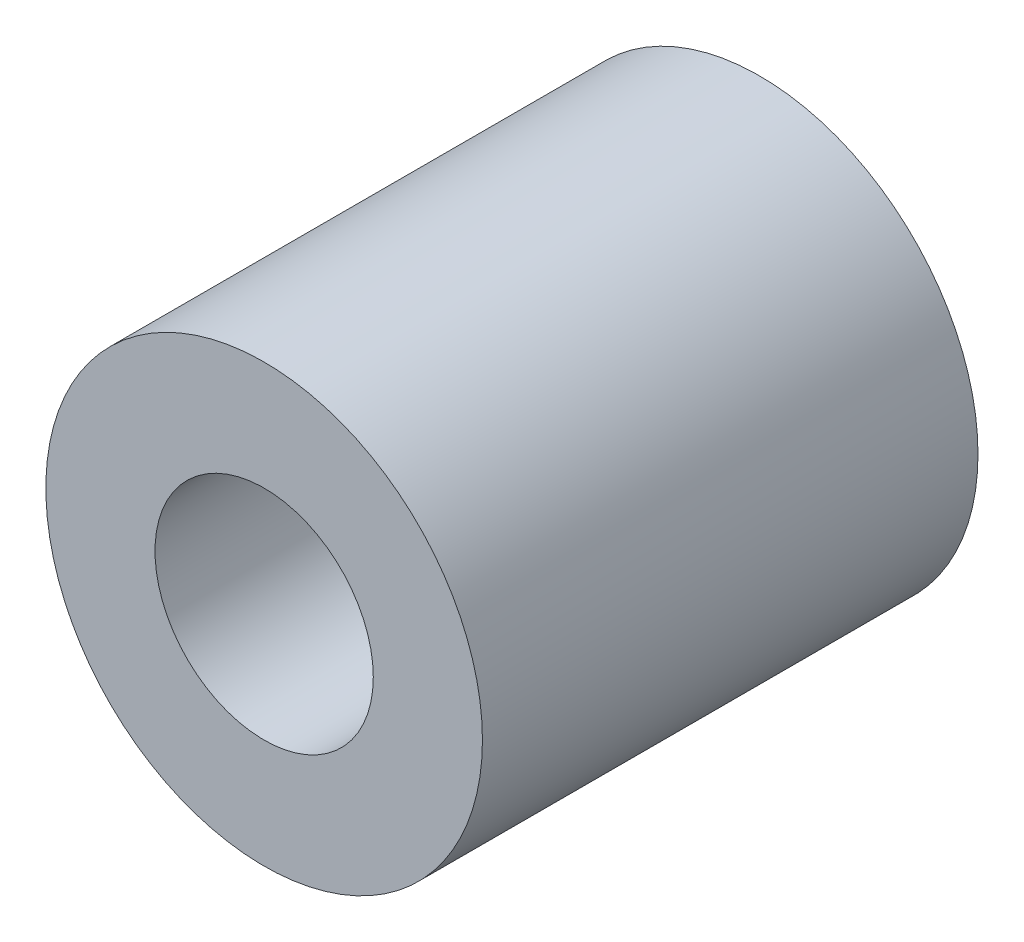
ISO-10303-21;
HEADER;
FILE_DESCRIPTION(('STEP AP214'),'2;1');
FILE_NAME('part.step','',(''),(''),'','','');
FILE_SCHEMA(('AUTOMOTIVE_DESIGN { 1 0 10303 214 1 1 1 1 }'));
ENDSEC;
DATA;
#1=APPLICATION_CONTEXT('core data for automotive mechanical design processes');
#2=APPLICATION_PROTOCOL_DEFINITION('international standard','automotive_design',2000,#1);
#3=PRODUCT_CONTEXT('',#1,'mechanical');
#4=PRODUCT('Part','Part','',(#3));
#5=PRODUCT_RELATED_PRODUCT_CATEGORY('part','',(#4));
#6=PRODUCT_DEFINITION_FORMATION('','',#4);
#7=PRODUCT_DEFINITION_CONTEXT('part definition',#1,'design');
#8=PRODUCT_DEFINITION('design','',#6,#7);
#9=PRODUCT_DEFINITION_SHAPE('','',#8);
#10=(LENGTH_UNIT() NAMED_UNIT(*) SI_UNIT(.MILLI.,.METRE.));
#11=(NAMED_UNIT(*) PLANE_ANGLE_UNIT() SI_UNIT($,.RADIAN.));
#12=(NAMED_UNIT(*) SI_UNIT($,.STERADIAN.) SOLID_ANGLE_UNIT());
#13=UNCERTAINTY_MEASURE_WITH_UNIT(LENGTH_MEASURE(1.E-05),#10,'distance_accuracy_value','');
#14=(GEOMETRIC_REPRESENTATION_CONTEXT(3) GLOBAL_UNCERTAINTY_ASSIGNED_CONTEXT((#13)) GLOBAL_UNIT_ASSIGNED_CONTEXT((#10,
#11,#12)) REPRESENTATION_CONTEXT('',''));
#15=CARTESIAN_POINT('',(0.,0.,0.));
#16=DIRECTION('',(0.,0.,1.));
#17=DIRECTION('',(1.,0.,0.));
#18=AXIS2_PLACEMENT_3D('',#15,#16,#17);
#19=CARTESIAN_POINT('',(0.,0.,11.35));
#20=DIRECTION('',(0.,0.,1.));
#21=DIRECTION('',(1.,0.,0.));
#22=AXIS2_PLACEMENT_3D('',#19,#20,#21);
#23=PLANE('',#22);
#24=CARTESIAN_POINT('',(0.,0.,11.35));
#25=DIRECTION('',(0.,0.,1.));
#26=DIRECTION('',(1.,0.,0.));
#27=AXIS2_PLACEMENT_3D('',#24,#25,#26);
#28=CIRCLE('',#27,5.);
#29=CARTESIAN_POINT('',(5.,0.,11.35));
#30=VERTEX_POINT('',#29);
#31=EDGE_CURVE('E10',#30,#30,#28,.T.);
#32=ORIENTED_EDGE('',*,*,#31,.T.);
#33=EDGE_LOOP('',(#32));
#34=FACE_BOUND('',#33,.T.);
#35=CARTESIAN_POINT('',(0.,0.,11.35));
#36=DIRECTION('',(0.,0.,1.));
#37=DIRECTION('',(1.,0.,0.));
#38=AXIS2_PLACEMENT_3D('',#35,#36,#37);
#39=CIRCLE('',#38,2.5);
#40=CARTESIAN_POINT('',(2.5,0.,11.35));
#41=VERTEX_POINT('',#40);
#42=EDGE_CURVE('E50',#41,#41,#39,.T.);
#43=ORIENTED_EDGE('',*,*,#42,.F.);
#44=EDGE_LOOP('',(#43));
#45=FACE_BOUND('',#44,.T.);
#46=ADVANCED_FACE('F37',(#34,#45),#23,.T.);
#47=CARTESIAN_POINT('',(0.,0.,0.));
#48=DIRECTION('',(0.,0.,1.));
#49=DIRECTION('',(1.,0.,0.));
#50=AXIS2_PLACEMENT_3D('',#47,#48,#49);
#51=PLANE('',#50);
#52=CARTESIAN_POINT('',(0.,0.,0.));
#53=DIRECTION('',(0.,0.,1.));
#54=DIRECTION('',(1.,0.,0.));
#55=AXIS2_PLACEMENT_3D('',#52,#53,#54);
#56=CIRCLE('',#55,5.);
#57=CARTESIAN_POINT('',(5.,0.,0.));
#58=VERTEX_POINT('',#57);
#59=EDGE_CURVE('E41',#58,#58,#56,.T.);
#60=ORIENTED_EDGE('',*,*,#59,.F.);
#61=EDGE_LOOP('',(#60));
#62=FACE_BOUND('',#61,.T.);
#63=CARTESIAN_POINT('',(0.,0.,0.));
#64=DIRECTION('',(0.,0.,1.));
#65=DIRECTION('',(1.,0.,0.));
#66=AXIS2_PLACEMENT_3D('',#63,#64,#65);
#67=CIRCLE('',#66,2.5);
#68=CARTESIAN_POINT('',(2.5,0.,0.));
#69=VERTEX_POINT('',#68);
#70=EDGE_CURVE('E52',#69,#69,#67,.T.);
#71=ORIENTED_EDGE('',*,*,#70,.T.);
#72=EDGE_LOOP('',(#71));
#73=FACE_BOUND('',#72,.T.);
#74=ADVANCED_FACE('F64',(#62,#73),#51,.F.);
#75=CARTESIAN_POINT('',(0.,0.,11.35));
#76=DIRECTION('',(0.,0.,-1.));
#77=DIRECTION('',(-1.,0.,0.));
#78=AXIS2_PLACEMENT_3D('',#75,#76,#77);
#79=CYLINDRICAL_SURFACE('',#78,5.);
#80=ORIENTED_EDGE('',*,*,#31,.F.);
#81=EDGE_LOOP('',(#80));
#82=FACE_BOUND('',#81,.T.);
#83=ORIENTED_EDGE('',*,*,#59,.T.);
#84=EDGE_LOOP('',(#83));
#85=FACE_BOUND('',#84,.T.);
#86=ADVANCED_FACE('F39',(#82,#85),#79,.T.);
#87=CARTESIAN_POINT('',(0.,0.,11.35));
#88=DIRECTION('',(0.,0.,-1.));
#89=DIRECTION('',(-1.,0.,0.));
#90=AXIS2_PLACEMENT_3D('',#87,#88,#89);
#91=CYLINDRICAL_SURFACE('',#90,2.5);
#92=ORIENTED_EDGE('',*,*,#42,.T.);
#93=EDGE_LOOP('',(#92));
#94=FACE_BOUND('',#93,.T.);
#95=ORIENTED_EDGE('',*,*,#70,.F.);
#96=EDGE_LOOP('',(#95));
#97=FACE_BOUND('',#96,.T.);
#98=ADVANCED_FACE('F60',(#94,#97),#91,.F.);
#99=CLOSED_SHELL('',(#46,#74,#86,#98));
#100=MANIFOLD_SOLID_BREP('B2',#99);
#101=ADVANCED_BREP_SHAPE_REPRESENTATION('',(#18,#100),#14);
#102=SHAPE_DEFINITION_REPRESENTATION(#9,#101);
ENDSEC;
END-ISO-10303-21;
